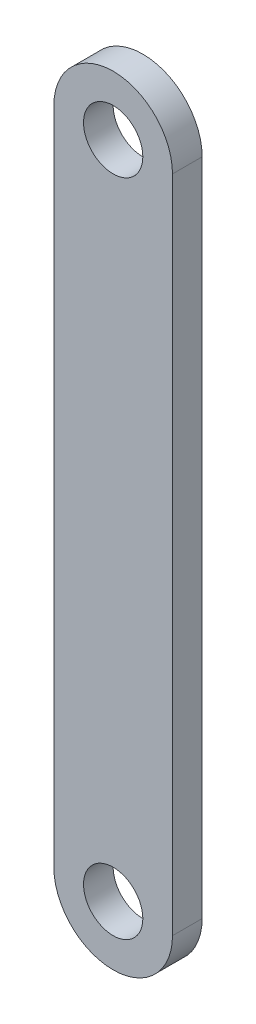
ISO-10303-21;
HEADER;
FILE_DESCRIPTION(('STEP AP214'),'2;1');
FILE_NAME('part.step','',(''),(''),'','','');
FILE_SCHEMA(('AUTOMOTIVE_DESIGN { 1 0 10303 214 1 1 1 1 }'));
ENDSEC;
DATA;
#1=APPLICATION_CONTEXT('core data for automotive mechanical design processes');
#2=APPLICATION_PROTOCOL_DEFINITION('international standard','automotive_design',2000,#1);
#3=PRODUCT_CONTEXT('',#1,'mechanical');
#4=PRODUCT('Part','Part','',(#3));
#5=PRODUCT_RELATED_PRODUCT_CATEGORY('part','',(#4));
#6=PRODUCT_DEFINITION_FORMATION('','',#4);
#7=PRODUCT_DEFINITION_CONTEXT('part definition',#1,'design');
#8=PRODUCT_DEFINITION('design','',#6,#7);
#9=PRODUCT_DEFINITION_SHAPE('','',#8);
#10=(LENGTH_UNIT() NAMED_UNIT(*) SI_UNIT(.MILLI.,.METRE.));
#11=(NAMED_UNIT(*) PLANE_ANGLE_UNIT() SI_UNIT($,.RADIAN.));
#12=(NAMED_UNIT(*) SI_UNIT($,.STERADIAN.) SOLID_ANGLE_UNIT());
#13=UNCERTAINTY_MEASURE_WITH_UNIT(LENGTH_MEASURE(1.E-05),#10,'distance_accuracy_value','');
#14=(GEOMETRIC_REPRESENTATION_CONTEXT(3) GLOBAL_UNCERTAINTY_ASSIGNED_CONTEXT((#13)) GLOBAL_UNIT_ASSIGNED_CONTEXT((#10,
#11,#12)) REPRESENTATION_CONTEXT('',''));
#15=CARTESIAN_POINT('',(0.,0.,0.));
#16=DIRECTION('',(0.,0.,1.));
#17=DIRECTION('',(1.,0.,0.));
#18=AXIS2_PLACEMENT_3D('',#15,#16,#17);
#19=CARTESIAN_POINT('',(-2.,0.,1.));
#20=DIRECTION('',(1.,0.,0.));
#21=DIRECTION('',(0.,1.,0.));
#22=AXIS2_PLACEMENT_3D('',#19,#20,#21);
#23=PLANE('',#22);
#24=DIRECTION('',(0.,-1.,0.));
#25=VECTOR('',#24,1.);
#26=CARTESIAN_POINT('',(-2.,0.,0.));
#27=LINE('',#26,#25);
#28=CARTESIAN_POINT('',(-2.,22.2444,0.));
#29=VERTEX_POINT('',#28);
#30=CARTESIAN_POINT('',(-2.,0.,0.));
#31=VERTEX_POINT('',#30);
#32=EDGE_CURVE('E107',#29,#31,#27,.T.);
#33=ORIENTED_EDGE('',*,*,#32,.T.);
#34=DIRECTION('',(0.,0.,-1.));
#35=VECTOR('',#34,1.);
#36=CARTESIAN_POINT('',(-2.,0.,1.));
#37=LINE('',#36,#35);
#38=CARTESIAN_POINT('',(-2.,0.,1.));
#39=VERTEX_POINT('',#38);
#40=EDGE_CURVE('E11',#39,#31,#37,.T.);
#41=ORIENTED_EDGE('',*,*,#40,.F.);
#42=DIRECTION('',(0.,-1.,0.));
#43=VECTOR('',#42,1.);
#44=CARTESIAN_POINT('',(-2.,0.,1.));
#45=LINE('',#44,#43);
#46=CARTESIAN_POINT('',(-2.,22.2444,1.));
#47=VERTEX_POINT('',#46);
#48=EDGE_CURVE('E86',#47,#39,#45,.T.);
#49=ORIENTED_EDGE('',*,*,#48,.F.);
#50=DIRECTION('',(0.,0.,-1.));
#51=VECTOR('',#50,1.);
#52=CARTESIAN_POINT('',(-2.,22.2444,1.));
#53=LINE('',#52,#51);
#54=EDGE_CURVE('E97',#47,#29,#53,.T.);
#55=ORIENTED_EDGE('',*,*,#54,.T.);
#56=EDGE_LOOP('',(#33,#41,#49,#55));
#57=FACE_BOUND('',#56,.T.);
#58=ADVANCED_FACE('F38',(#57),#23,.F.);
#59=CARTESIAN_POINT('',(0.,0.,1.));
#60=DIRECTION('',(0.,0.,-1.));
#61=DIRECTION('',(-1.,0.,0.));
#62=AXIS2_PLACEMENT_3D('',#59,#60,#61);
#63=CYLINDRICAL_SURFACE('',#62,2.);
#64=CARTESIAN_POINT('',(0.,0.,0.));
#65=DIRECTION('',(0.,0.,1.));
#66=DIRECTION('',(1.,0.,0.));
#67=AXIS2_PLACEMENT_3D('',#64,#65,#66);
#68=CIRCLE('',#67,2.);
#69=CARTESIAN_POINT('',(2.,0.,0.));
#70=VERTEX_POINT('',#69);
#71=EDGE_CURVE('E91',#31,#70,#68,.T.);
#72=ORIENTED_EDGE('',*,*,#71,.T.);
#73=DIRECTION('',(0.,0.,-1.));
#74=VECTOR('',#73,1.);
#75=CARTESIAN_POINT('',(2.,0.,1.));
#76=LINE('',#75,#74);
#77=CARTESIAN_POINT('',(2.,0.,1.));
#78=VERTEX_POINT('',#77);
#79=EDGE_CURVE('E47',#78,#70,#76,.T.);
#80=ORIENTED_EDGE('',*,*,#79,.F.);
#81=CARTESIAN_POINT('',(0.,0.,1.));
#82=DIRECTION('',(0.,0.,1.));
#83=DIRECTION('',(1.,0.,0.));
#84=AXIS2_PLACEMENT_3D('',#81,#82,#83);
#85=CIRCLE('',#84,2.);
#86=EDGE_CURVE('E81',#39,#78,#85,.T.);
#87=ORIENTED_EDGE('',*,*,#86,.F.);
#88=ORIENTED_EDGE('',*,*,#40,.T.);
#89=EDGE_LOOP('',(#72,#80,#87,#88));
#90=FACE_BOUND('',#89,.T.);
#91=ADVANCED_FACE('F90',(#90),#63,.T.);
#92=CARTESIAN_POINT('',(2.,0.,1.));
#93=DIRECTION('',(1.,0.,0.));
#94=DIRECTION('',(0.,1.,0.));
#95=AXIS2_PLACEMENT_3D('',#92,#93,#94);
#96=PLANE('',#95);
#97=DIRECTION('',(0.,-1.,0.));
#98=VECTOR('',#97,1.);
#99=CARTESIAN_POINT('',(2.,0.,0.));
#100=LINE('',#99,#98);
#101=CARTESIAN_POINT('',(2.,22.2444,0.));
#102=VERTEX_POINT('',#101);
#103=EDGE_CURVE('E111',#102,#70,#100,.T.);
#104=ORIENTED_EDGE('',*,*,#103,.F.);
#105=DIRECTION('',(0.,0.,-1.));
#106=VECTOR('',#105,1.);
#107=CARTESIAN_POINT('',(2.,22.2444,1.));
#108=LINE('',#107,#106);
#109=CARTESIAN_POINT('',(2.,22.2444,1.));
#110=VERTEX_POINT('',#109);
#111=EDGE_CURVE('E71',#110,#102,#108,.T.);
#112=ORIENTED_EDGE('',*,*,#111,.F.);
#113=DIRECTION('',(0.,-1.,0.));
#114=VECTOR('',#113,1.);
#115=CARTESIAN_POINT('',(2.,0.,1.));
#116=LINE('',#115,#114);
#117=EDGE_CURVE('E84',#110,#78,#116,.T.);
#118=ORIENTED_EDGE('',*,*,#117,.T.);
#119=ORIENTED_EDGE('',*,*,#79,.T.);
#120=EDGE_LOOP('',(#104,#112,#118,#119));
#121=FACE_BOUND('',#120,.T.);
#122=ADVANCED_FACE('F95',(#121),#96,.T.);
#123=CARTESIAN_POINT('',(0.,22.2444,1.));
#124=DIRECTION('',(0.,0.,-1.));
#125=DIRECTION('',(-1.,0.,0.));
#126=AXIS2_PLACEMENT_3D('',#123,#124,#125);
#127=CYLINDRICAL_SURFACE('',#126,1.);
#128=CARTESIAN_POINT('',(0.,22.2444,1.));
#129=DIRECTION('',(0.,0.,1.));
#130=DIRECTION('',(1.,0.,0.));
#131=AXIS2_PLACEMENT_3D('',#128,#129,#130);
#132=CIRCLE('',#131,1.);
#133=CARTESIAN_POINT('',(1.,22.2444,1.));
#134=VERTEX_POINT('',#133);
#135=EDGE_CURVE('E149',#134,#134,#132,.T.);
#136=ORIENTED_EDGE('',*,*,#135,.T.);
#137=EDGE_LOOP('',(#136));
#138=FACE_BOUND('',#137,.T.);
#139=CARTESIAN_POINT('',(0.,22.2444,0.));
#140=DIRECTION('',(0.,0.,1.));
#141=DIRECTION('',(1.,0.,0.));
#142=AXIS2_PLACEMENT_3D('',#139,#140,#141);
#143=CIRCLE('',#142,1.);
#144=CARTESIAN_POINT('',(1.,22.2444,0.));
#145=VERTEX_POINT('',#144);
#146=EDGE_CURVE('E104',#145,#145,#143,.T.);
#147=ORIENTED_EDGE('',*,*,#146,.F.);
#148=EDGE_LOOP('',(#147));
#149=FACE_BOUND('',#148,.T.);
#150=ADVANCED_FACE('F138',(#138,#149),#127,.F.);
#151=CARTESIAN_POINT('',(0.,0.,1.));
#152=DIRECTION('',(0.,0.,-1.));
#153=DIRECTION('',(-1.,0.,0.));
#154=AXIS2_PLACEMENT_3D('',#151,#152,#153);
#155=CYLINDRICAL_SURFACE('',#154,1.);
#156=CARTESIAN_POINT('',(0.,0.,1.));
#157=DIRECTION('',(0.,0.,1.));
#158=DIRECTION('',(1.,0.,0.));
#159=AXIS2_PLACEMENT_3D('',#156,#157,#158);
#160=CIRCLE('',#159,1.);
#161=CARTESIAN_POINT('',(1.,0.,1.));
#162=VERTEX_POINT('',#161);
#163=EDGE_CURVE('E114',#162,#162,#160,.T.);
#164=ORIENTED_EDGE('',*,*,#163,.T.);
#165=EDGE_LOOP('',(#164));
#166=FACE_BOUND('',#165,.T.);
#167=CARTESIAN_POINT('',(0.,0.,0.));
#168=DIRECTION('',(0.,0.,1.));
#169=DIRECTION('',(1.,0.,0.));
#170=AXIS2_PLACEMENT_3D('',#167,#168,#169);
#171=CIRCLE('',#170,1.);
#172=CARTESIAN_POINT('',(1.,0.,0.));
#173=VERTEX_POINT('',#172);
#174=EDGE_CURVE('E101',#173,#173,#171,.T.);
#175=ORIENTED_EDGE('',*,*,#174,.F.);
#176=EDGE_LOOP('',(#175));
#177=FACE_BOUND('',#176,.T.);
#178=ADVANCED_FACE('F40',(#166,#177),#155,.F.);
#179=CARTESIAN_POINT('',(0.,22.2444,1.));
#180=DIRECTION('',(0.,0.,-1.));
#181=DIRECTION('',(-1.,0.,0.));
#182=AXIS2_PLACEMENT_3D('',#179,#180,#181);
#183=CYLINDRICAL_SURFACE('',#182,2.);
#184=CARTESIAN_POINT('',(0.,22.2444,0.));
#185=DIRECTION('',(0.,0.,1.));
#186=DIRECTION('',(1.,0.,0.));
#187=AXIS2_PLACEMENT_3D('',#184,#185,#186);
#188=CIRCLE('',#187,2.);
#189=EDGE_CURVE('E74',#102,#29,#188,.T.);
#190=ORIENTED_EDGE('',*,*,#189,.T.);
#191=ORIENTED_EDGE('',*,*,#54,.F.);
#192=CARTESIAN_POINT('',(0.,22.2444,1.));
#193=DIRECTION('',(0.,0.,1.));
#194=DIRECTION('',(1.,0.,0.));
#195=AXIS2_PLACEMENT_3D('',#192,#193,#194);
#196=CIRCLE('',#195,2.);
#197=EDGE_CURVE('E55',#110,#47,#196,.T.);
#198=ORIENTED_EDGE('',*,*,#197,.F.);
#199=ORIENTED_EDGE('',*,*,#111,.T.);
#200=EDGE_LOOP('',(#190,#191,#198,#199));
#201=FACE_BOUND('',#200,.T.);
#202=ADVANCED_FACE('F126',(#201),#183,.T.);
#203=CARTESIAN_POINT('',(0.,0.,1.));
#204=DIRECTION('',(0.,0.,1.));
#205=DIRECTION('',(1.,0.,0.));
#206=AXIS2_PLACEMENT_3D('',#203,#204,#205);
#207=PLANE('',#206);
#208=ORIENTED_EDGE('',*,*,#163,.F.);
#209=EDGE_LOOP('',(#208));
#210=FACE_BOUND('',#209,.T.);
#211=ORIENTED_EDGE('',*,*,#135,.F.);
#212=EDGE_LOOP('',(#211));
#213=FACE_BOUND('',#212,.T.);
#214=ORIENTED_EDGE('',*,*,#48,.T.);
#215=ORIENTED_EDGE('',*,*,#86,.T.);
#216=ORIENTED_EDGE('',*,*,#117,.F.);
#217=ORIENTED_EDGE('',*,*,#197,.T.);
#218=EDGE_LOOP('',(#214,#215,#216,#217));
#219=FACE_BOUND('',#218,.T.);
#220=ADVANCED_FACE('F82',(#210,#213,#219),#207,.T.);
#221=CARTESIAN_POINT('',(0.,0.,0.));
#222=DIRECTION('',(0.,0.,1.));
#223=DIRECTION('',(1.,0.,0.));
#224=AXIS2_PLACEMENT_3D('',#221,#222,#223);
#225=PLANE('',#224);
#226=ORIENTED_EDGE('',*,*,#174,.T.);
#227=EDGE_LOOP('',(#226));
#228=FACE_BOUND('',#227,.T.);
#229=ORIENTED_EDGE('',*,*,#146,.T.);
#230=EDGE_LOOP('',(#229));
#231=FACE_BOUND('',#230,.T.);
#232=ORIENTED_EDGE('',*,*,#32,.F.);
#233=ORIENTED_EDGE('',*,*,#189,.F.);
#234=ORIENTED_EDGE('',*,*,#103,.T.);
#235=ORIENTED_EDGE('',*,*,#71,.F.);
#236=EDGE_LOOP('',(#232,#233,#234,#235));
#237=FACE_BOUND('',#236,.T.);
#238=ADVANCED_FACE('F119',(#228,#231,#237),#225,.F.);
#239=CLOSED_SHELL('',(#58,#91,#122,#150,#178,#202,#220,#238));
#240=MANIFOLD_SOLID_BREP('B2',#239);
#241=ADVANCED_BREP_SHAPE_REPRESENTATION('',(#18,#240),#14);
#242=SHAPE_DEFINITION_REPRESENTATION(#9,#241);
ENDSEC;
END-ISO-10303-21;
